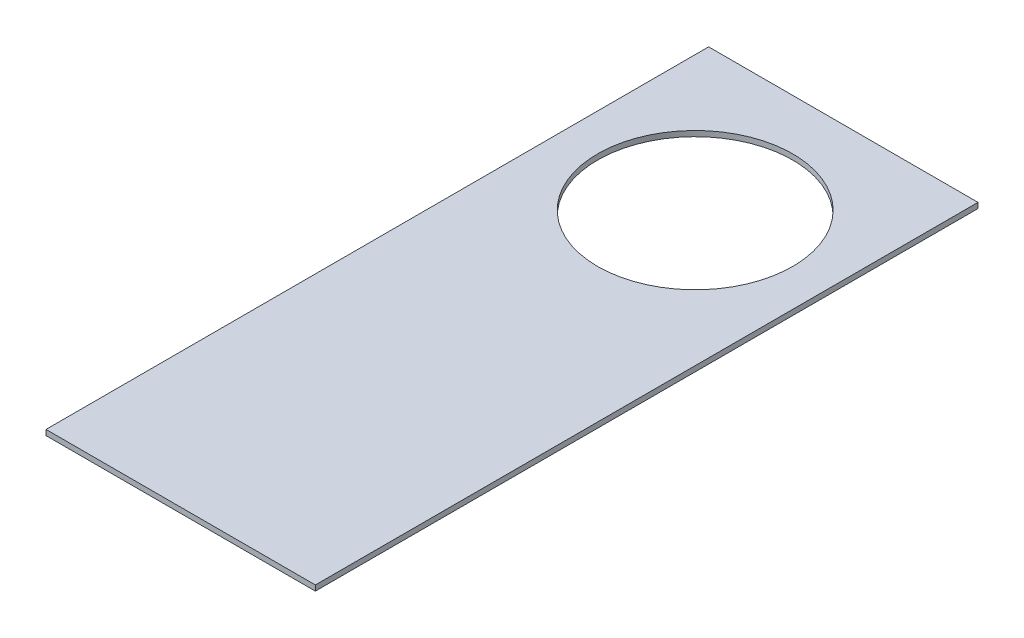
ISO-10303-21;
HEADER;
FILE_DESCRIPTION(('STEP AP214'),'2;1');
FILE_NAME('part.step','',(''),(''),'','','');
FILE_SCHEMA(('AUTOMOTIVE_DESIGN { 1 0 10303 214 1 1 1 1 }'));
ENDSEC;
DATA;
#1=APPLICATION_CONTEXT('core data for automotive mechanical design processes');
#2=APPLICATION_PROTOCOL_DEFINITION('international standard','automotive_design',2000,#1);
#3=PRODUCT_CONTEXT('',#1,'mechanical');
#4=PRODUCT('Part','Part','',(#3));
#5=PRODUCT_RELATED_PRODUCT_CATEGORY('part','',(#4));
#6=PRODUCT_DEFINITION_FORMATION('','',#4);
#7=PRODUCT_DEFINITION_CONTEXT('part definition',#1,'design');
#8=PRODUCT_DEFINITION('design','',#6,#7);
#9=PRODUCT_DEFINITION_SHAPE('','',#8);
#10=(LENGTH_UNIT() NAMED_UNIT(*) SI_UNIT(.MILLI.,.METRE.));
#11=(NAMED_UNIT(*) PLANE_ANGLE_UNIT() SI_UNIT($,.RADIAN.));
#12=(NAMED_UNIT(*) SI_UNIT($,.STERADIAN.) SOLID_ANGLE_UNIT());
#13=UNCERTAINTY_MEASURE_WITH_UNIT(LENGTH_MEASURE(1.E-05),#10,'distance_accuracy_value','');
#14=(GEOMETRIC_REPRESENTATION_CONTEXT(3) GLOBAL_UNCERTAINTY_ASSIGNED_CONTEXT((#13)) GLOBAL_UNIT_ASSIGNED_CONTEXT((#10,
#11,#12)) REPRESENTATION_CONTEXT('',''));
#15=CARTESIAN_POINT('',(0.,0.,0.));
#16=DIRECTION('',(0.,0.,1.));
#17=DIRECTION('',(1.,0.,0.));
#18=AXIS2_PLACEMENT_3D('',#15,#16,#17);
#19=CARTESIAN_POINT('',(0.,3.175,0.));
#20=DIRECTION('',(1.,0.,0.));
#21=DIRECTION('',(0.,0.,-1.));
#22=AXIS2_PLACEMENT_3D('',#19,#20,#21);
#23=PLANE('',#22);
#24=DIRECTION('',(0.,0.,1.));
#25=VECTOR('',#24,1.);
#26=CARTESIAN_POINT('',(0.,0.,0.));
#27=LINE('',#26,#25);
#28=CARTESIAN_POINT('',(0.,0.,-390.525));
#29=VERTEX_POINT('',#28);
#30=CARTESIAN_POINT('',(0.,0.,0.));
#31=VERTEX_POINT('',#30);
#32=EDGE_CURVE('E106',#29,#31,#27,.T.);
#33=ORIENTED_EDGE('',*,*,#32,.T.);
#34=DIRECTION('',(0.,-1.,0.));
#35=VECTOR('',#34,1.);
#36=CARTESIAN_POINT('',(0.,3.175,0.));
#37=LINE('',#36,#35);
#38=CARTESIAN_POINT('',(0.,3.175,0.));
#39=VERTEX_POINT('',#38);
#40=EDGE_CURVE('E11',#39,#31,#37,.T.);
#41=ORIENTED_EDGE('',*,*,#40,.F.);
#42=DIRECTION('',(0.,0.,1.));
#43=VECTOR('',#42,1.);
#44=CARTESIAN_POINT('',(0.,3.175,0.));
#45=LINE('',#44,#43);
#46=CARTESIAN_POINT('',(0.,3.175,-390.525));
#47=VERTEX_POINT('',#46);
#48=EDGE_CURVE('E93',#47,#39,#45,.T.);
#49=ORIENTED_EDGE('',*,*,#48,.F.);
#50=DIRECTION('',(0.,-1.,0.));
#51=VECTOR('',#50,1.);
#52=CARTESIAN_POINT('',(0.,3.175,-390.525));
#53=LINE('',#52,#51);
#54=EDGE_CURVE('E105',#47,#29,#53,.T.);
#55=ORIENTED_EDGE('',*,*,#54,.T.);
#56=EDGE_LOOP('',(#33,#41,#49,#55));
#57=FACE_BOUND('',#56,.T.);
#58=ADVANCED_FACE('F43',(#57),#23,.F.);
#59=CARTESIAN_POINT('',(0.,3.175,0.));
#60=DIRECTION('',(0.,0.,-1.));
#61=DIRECTION('',(-1.,0.,0.));
#62=AXIS2_PLACEMENT_3D('',#59,#60,#61);
#63=PLANE('',#62);
#64=DIRECTION('',(1.,0.,0.));
#65=VECTOR('',#64,1.);
#66=CARTESIAN_POINT('',(0.,0.,0.));
#67=LINE('',#66,#65);
#68=CARTESIAN_POINT('',(158.75,0.,0.));
#69=VERTEX_POINT('',#68);
#70=EDGE_CURVE('E96',#31,#69,#67,.T.);
#71=ORIENTED_EDGE('',*,*,#70,.T.);
#72=DIRECTION('',(0.,-1.,0.));
#73=VECTOR('',#72,1.);
#74=CARTESIAN_POINT('',(158.75,3.175,0.));
#75=LINE('',#74,#73);
#76=CARTESIAN_POINT('',(158.75,3.175,0.));
#77=VERTEX_POINT('',#76);
#78=EDGE_CURVE('E51',#77,#69,#75,.T.);
#79=ORIENTED_EDGE('',*,*,#78,.F.);
#80=DIRECTION('',(1.,0.,0.));
#81=VECTOR('',#80,1.);
#82=CARTESIAN_POINT('',(0.,3.175,0.));
#83=LINE('',#82,#81);
#84=EDGE_CURVE('E90',#39,#77,#83,.T.);
#85=ORIENTED_EDGE('',*,*,#84,.F.);
#86=ORIENTED_EDGE('',*,*,#40,.T.);
#87=EDGE_LOOP('',(#71,#79,#85,#86));
#88=FACE_BOUND('',#87,.T.);
#89=ADVANCED_FACE('F97',(#88),#63,.F.);
#90=CARTESIAN_POINT('',(158.75,3.175,0.));
#91=DIRECTION('',(-1.,0.,0.));
#92=DIRECTION('',(0.,0.,1.));
#93=AXIS2_PLACEMENT_3D('',#90,#91,#92);
#94=PLANE('',#93);
#95=DIRECTION('',(0.,0.,-1.));
#96=VECTOR('',#95,1.);
#97=CARTESIAN_POINT('',(158.75,0.,0.));
#98=LINE('',#97,#96);
#99=CARTESIAN_POINT('',(158.75,0.,-390.525));
#100=VERTEX_POINT('',#99);
#101=EDGE_CURVE('E77',#69,#100,#98,.T.);
#102=ORIENTED_EDGE('',*,*,#101,.T.);
#103=DIRECTION('',(0.,-1.,0.));
#104=VECTOR('',#103,1.);
#105=CARTESIAN_POINT('',(158.75,3.175,-390.525));
#106=LINE('',#105,#104);
#107=CARTESIAN_POINT('',(158.75,3.175,-390.525));
#108=VERTEX_POINT('',#107);
#109=EDGE_CURVE('E100',#108,#100,#106,.T.);
#110=ORIENTED_EDGE('',*,*,#109,.F.);
#111=DIRECTION('',(0.,0.,-1.));
#112=VECTOR('',#111,1.);
#113=CARTESIAN_POINT('',(158.75,3.175,0.));
#114=LINE('',#113,#112);
#115=EDGE_CURVE('E95',#77,#108,#114,.T.);
#116=ORIENTED_EDGE('',*,*,#115,.F.);
#117=ORIENTED_EDGE('',*,*,#78,.T.);
#118=EDGE_LOOP('',(#102,#110,#116,#117));
#119=FACE_BOUND('',#118,.T.);
#120=ADVANCED_FACE('F99',(#119),#94,.F.);
#121=CARTESIAN_POINT('',(0.,3.175,-390.525));
#122=DIRECTION('',(0.,0.,1.));
#123=DIRECTION('',(1.,0.,0.));
#124=AXIS2_PLACEMENT_3D('',#121,#122,#123);
#125=PLANE('',#124);
#126=DIRECTION('',(-1.,0.,0.));
#127=VECTOR('',#126,1.);
#128=CARTESIAN_POINT('',(0.,0.,-390.525));
#129=LINE('',#128,#127);
#130=EDGE_CURVE('E85',#100,#29,#129,.T.);
#131=ORIENTED_EDGE('',*,*,#130,.T.);
#132=ORIENTED_EDGE('',*,*,#54,.F.);
#133=DIRECTION('',(-1.,0.,0.));
#134=VECTOR('',#133,1.);
#135=CARTESIAN_POINT('',(0.,3.175,-390.525));
#136=LINE('',#135,#134);
#137=EDGE_CURVE('E56',#108,#47,#136,.T.);
#138=ORIENTED_EDGE('',*,*,#137,.F.);
#139=ORIENTED_EDGE('',*,*,#109,.T.);
#140=EDGE_LOOP('',(#131,#132,#138,#139));
#141=FACE_BOUND('',#140,.T.);
#142=ADVANCED_FACE('F112',(#141),#125,.F.);
#143=CARTESIAN_POINT('',(0.,3.175,0.));
#144=DIRECTION('',(0.,-1.,0.));
#145=DIRECTION('',(0.,0.,-1.));
#146=AXIS2_PLACEMENT_3D('',#143,#144,#145);
#147=PLANE('',#146);
#148=CARTESIAN_POINT('',(79.375,3.175,-303.2125));
#149=DIRECTION('',(0.,1.,0.));
#150=DIRECTION('',(0.,0.,1.));
#151=AXIS2_PLACEMENT_3D('',#148,#149,#150);
#152=CIRCLE('',#151,57.5);
#153=CARTESIAN_POINT('',(79.375,3.175,-245.7125));
#154=VERTEX_POINT('',#153);
#155=EDGE_CURVE('E119',#154,#154,#152,.T.);
#156=ORIENTED_EDGE('',*,*,#155,.F.);
#157=EDGE_LOOP('',(#156));
#158=FACE_BOUND('',#157,.T.);
#159=ORIENTED_EDGE('',*,*,#48,.T.);
#160=ORIENTED_EDGE('',*,*,#84,.T.);
#161=ORIENTED_EDGE('',*,*,#115,.T.);
#162=ORIENTED_EDGE('',*,*,#137,.T.);
#163=EDGE_LOOP('',(#159,#160,#161,#162));
#164=FACE_BOUND('',#163,.T.);
#165=ADVANCED_FACE('F86',(#158,#164),#147,.F.);
#166=CARTESIAN_POINT('',(0.,0.,0.));
#167=DIRECTION('',(0.,-1.,0.));
#168=DIRECTION('',(0.,0.,-1.));
#169=AXIS2_PLACEMENT_3D('',#166,#167,#168);
#170=PLANE('',#169);
#171=CARTESIAN_POINT('',(79.375,0.,-303.2125));
#172=DIRECTION('',(0.,1.,0.));
#173=DIRECTION('',(0.,0.,1.));
#174=AXIS2_PLACEMENT_3D('',#171,#172,#173);
#175=CIRCLE('',#174,57.5);
#176=CARTESIAN_POINT('',(79.375,0.,-245.7125));
#177=VERTEX_POINT('',#176);
#178=EDGE_CURVE('E107',#177,#177,#175,.T.);
#179=ORIENTED_EDGE('',*,*,#178,.T.);
#180=EDGE_LOOP('',(#179));
#181=FACE_BOUND('',#180,.T.);
#182=ORIENTED_EDGE('',*,*,#32,.F.);
#183=ORIENTED_EDGE('',*,*,#130,.F.);
#184=ORIENTED_EDGE('',*,*,#101,.F.);
#185=ORIENTED_EDGE('',*,*,#70,.F.);
#186=EDGE_LOOP('',(#182,#183,#184,#185));
#187=FACE_BOUND('',#186,.T.);
#188=ADVANCED_FACE('F120',(#181,#187),#170,.T.);
#189=CARTESIAN_POINT('',(79.375,0.,-303.2125));
#190=DIRECTION('',(0.,1.,0.));
#191=DIRECTION('',(0.,0.,1.));
#192=AXIS2_PLACEMENT_3D('',#189,#190,#191);
#193=CYLINDRICAL_SURFACE('',#192,57.5);
#194=ORIENTED_EDGE('',*,*,#178,.F.);
#195=EDGE_LOOP('',(#194));
#196=FACE_BOUND('',#195,.T.);
#197=ORIENTED_EDGE('',*,*,#155,.T.);
#198=EDGE_LOOP('',(#197));
#199=FACE_BOUND('',#198,.T.);
#200=ADVANCED_FACE('F130',(#196,#199),#193,.F.);
#201=CLOSED_SHELL('',(#58,#89,#120,#142,#165,#188,#200));
#202=MANIFOLD_SOLID_BREP('B2',#201);
#203=ADVANCED_BREP_SHAPE_REPRESENTATION('',(#18,#202),#14);
#204=SHAPE_DEFINITION_REPRESENTATION(#9,#203);
ENDSEC;
END-ISO-10303-21;
